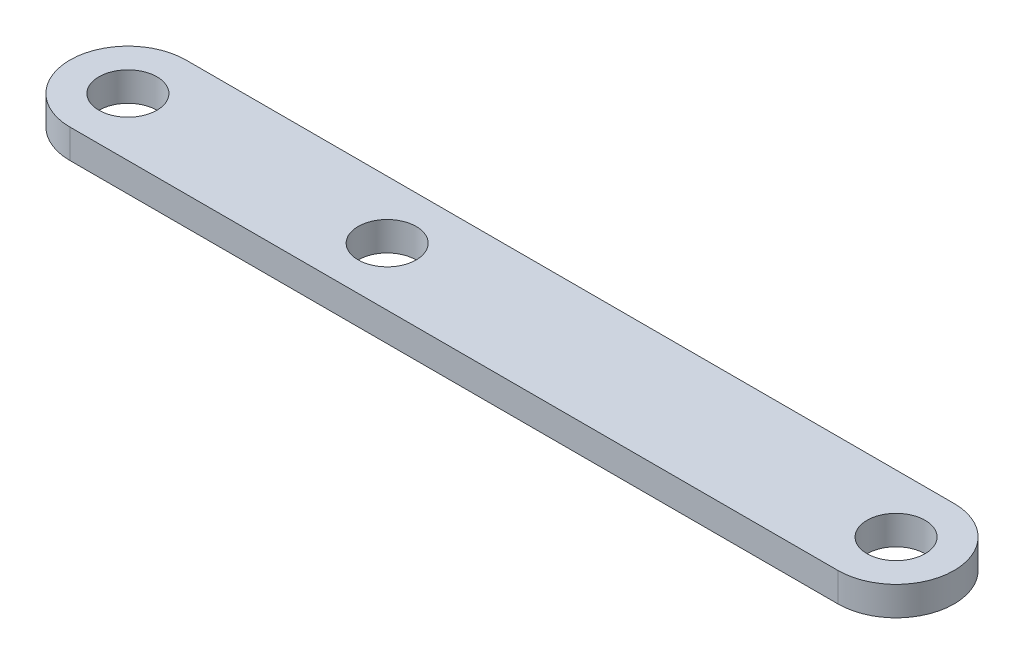
ISO-10303-21;
HEADER;
FILE_DESCRIPTION(('STEP AP214'),'2;1');
FILE_NAME('part.step','',(''),(''),'','','');
FILE_SCHEMA(('AUTOMOTIVE_DESIGN { 1 0 10303 214 1 1 1 1 }'));
ENDSEC;
DATA;
#1=APPLICATION_CONTEXT('core data for automotive mechanical design processes');
#2=APPLICATION_PROTOCOL_DEFINITION('international standard','automotive_design',2000,#1);
#3=PRODUCT_CONTEXT('',#1,'mechanical');
#4=PRODUCT('Part','Part','',(#3));
#5=PRODUCT_RELATED_PRODUCT_CATEGORY('part','',(#4));
#6=PRODUCT_DEFINITION_FORMATION('','',#4);
#7=PRODUCT_DEFINITION_CONTEXT('part definition',#1,'design');
#8=PRODUCT_DEFINITION('design','',#6,#7);
#9=PRODUCT_DEFINITION_SHAPE('','',#8);
#10=(LENGTH_UNIT() NAMED_UNIT(*) SI_UNIT(.MILLI.,.METRE.));
#11=(NAMED_UNIT(*) PLANE_ANGLE_UNIT() SI_UNIT($,.RADIAN.));
#12=(NAMED_UNIT(*) SI_UNIT($,.STERADIAN.) SOLID_ANGLE_UNIT());
#13=UNCERTAINTY_MEASURE_WITH_UNIT(LENGTH_MEASURE(1.E-05),#10,'distance_accuracy_value','');
#14=(GEOMETRIC_REPRESENTATION_CONTEXT(3) GLOBAL_UNCERTAINTY_ASSIGNED_CONTEXT((#13)) GLOBAL_UNIT_ASSIGNED_CONTEXT((#10,
#11,#12)) REPRESENTATION_CONTEXT('',''));
#15=CARTESIAN_POINT('',(0.,0.,0.));
#16=DIRECTION('',(0.,0.,1.));
#17=DIRECTION('',(1.,0.,0.));
#18=AXIS2_PLACEMENT_3D('',#15,#16,#17);
#19=CARTESIAN_POINT('',(0.,3.,0.));
#20=DIRECTION('',(0.,1.,0.));
#21=DIRECTION('',(0.,0.,1.));
#22=AXIS2_PLACEMENT_3D('',#19,#20,#21);
#23=PLANE('',#22);
#24=CARTESIAN_POINT('',(79.41,3.,0.));
#25=DIRECTION('',(0.,1.,0.));
#26=DIRECTION('',(0.,0.,1.));
#27=AXIS2_PLACEMENT_3D('',#24,#25,#26);
#28=CIRCLE('',#27,3.00000000000001);
#29=CARTESIAN_POINT('',(79.41,3.,3.00000000000001));
#30=VERTEX_POINT('',#29);
#31=EDGE_CURVE('E121',#30,#30,#28,.T.);
#32=ORIENTED_EDGE('',*,*,#31,.F.);
#33=EDGE_LOOP('',(#32));
#34=FACE_BOUND('',#33,.T.);
#35=CARTESIAN_POINT('',(0.,3.,0.));
#36=DIRECTION('',(0.,1.,0.));
#37=DIRECTION('',(0.,0.,1.));
#38=AXIS2_PLACEMENT_3D('',#35,#36,#37);
#39=CIRCLE('',#38,6.);
#40=CARTESIAN_POINT('',(0.,3.,-6.));
#41=VERTEX_POINT('',#40);
#42=CARTESIAN_POINT('',(0.,3.,6.));
#43=VERTEX_POINT('',#42);
#44=EDGE_CURVE('E91',#41,#43,#39,.T.);
#45=ORIENTED_EDGE('',*,*,#44,.T.);
#46=DIRECTION('',(1.,0.,0.));
#47=VECTOR('',#46,1.);
#48=CARTESIAN_POINT('',(0.,3.,6.));
#49=LINE('',#48,#47);
#50=CARTESIAN_POINT('',(79.41,3.,6.));
#51=VERTEX_POINT('',#50);
#52=EDGE_CURVE('E86',#43,#51,#49,.T.);
#53=ORIENTED_EDGE('',*,*,#52,.T.);
#54=CARTESIAN_POINT('',(79.41,3.,0.));
#55=DIRECTION('',(0.,1.,0.));
#56=DIRECTION('',(0.,0.,1.));
#57=AXIS2_PLACEMENT_3D('',#54,#55,#56);
#58=CIRCLE('',#57,6.);
#59=CARTESIAN_POINT('',(79.41,3.,-6.));
#60=VERTEX_POINT('',#59);
#61=EDGE_CURVE('E89',#51,#60,#58,.T.);
#62=ORIENTED_EDGE('',*,*,#61,.T.);
#63=DIRECTION('',(-1.,0.,0.));
#64=VECTOR('',#63,1.);
#65=CARTESIAN_POINT('',(0.,3.,-6.));
#66=LINE('',#65,#64);
#67=EDGE_CURVE('E56',#60,#41,#66,.T.);
#68=ORIENTED_EDGE('',*,*,#67,.T.);
#69=EDGE_LOOP('',(#45,#53,#62,#68));
#70=FACE_BOUND('',#69,.T.);
#71=CARTESIAN_POINT('',(0.,3.,0.));
#72=DIRECTION('',(0.,1.,0.));
#73=DIRECTION('',(0.,0.,1.));
#74=AXIS2_PLACEMENT_3D('',#71,#72,#73);
#75=CIRCLE('',#74,3.);
#76=CARTESIAN_POINT('',(0.,3.,3.));
#77=VERTEX_POINT('',#76);
#78=EDGE_CURVE('E106',#77,#77,#75,.T.);
#79=ORIENTED_EDGE('',*,*,#78,.F.);
#80=EDGE_LOOP('',(#79));
#81=FACE_BOUND('',#80,.T.);
#82=CARTESIAN_POINT('',(26.8,3.,0.));
#83=DIRECTION('',(0.,1.,0.));
#84=DIRECTION('',(0.,0.,1.));
#85=AXIS2_PLACEMENT_3D('',#82,#83,#84);
#86=CIRCLE('',#85,3.);
#87=CARTESIAN_POINT('',(26.8,3.,3.));
#88=VERTEX_POINT('',#87);
#89=EDGE_CURVE('E127',#88,#88,#86,.T.);
#90=ORIENTED_EDGE('',*,*,#89,.F.);
#91=EDGE_LOOP('',(#90));
#92=FACE_BOUND('',#91,.T.);
#93=ADVANCED_FACE('F39',(#34,#70,#81,#92),#23,.T.);
#94=CARTESIAN_POINT('',(0.,0.,0.));
#95=DIRECTION('',(0.,1.,0.));
#96=DIRECTION('',(0.,0.,1.));
#97=AXIS2_PLACEMENT_3D('',#94,#95,#96);
#98=PLANE('',#97);
#99=CARTESIAN_POINT('',(0.,0.,0.));
#100=DIRECTION('',(0.,1.,0.));
#101=DIRECTION('',(0.,0.,1.));
#102=AXIS2_PLACEMENT_3D('',#99,#100,#101);
#103=CIRCLE('',#102,6.);
#104=CARTESIAN_POINT('',(0.,0.,-6.));
#105=VERTEX_POINT('',#104);
#106=CARTESIAN_POINT('',(0.,0.,6.));
#107=VERTEX_POINT('',#106);
#108=EDGE_CURVE('E103',#105,#107,#103,.T.);
#109=ORIENTED_EDGE('',*,*,#108,.F.);
#110=DIRECTION('',(-1.,0.,0.));
#111=VECTOR('',#110,1.);
#112=CARTESIAN_POINT('',(0.,0.,-6.));
#113=LINE('',#112,#111);
#114=CARTESIAN_POINT('',(79.41,0.,-6.));
#115=VERTEX_POINT('',#114);
#116=EDGE_CURVE('E79',#115,#105,#113,.T.);
#117=ORIENTED_EDGE('',*,*,#116,.F.);
#118=CARTESIAN_POINT('',(79.41,0.,0.));
#119=DIRECTION('',(0.,1.,0.));
#120=DIRECTION('',(0.,0.,1.));
#121=AXIS2_PLACEMENT_3D('',#118,#119,#120);
#122=CIRCLE('',#121,6.);
#123=CARTESIAN_POINT('',(79.41,0.,6.));
#124=VERTEX_POINT('',#123);
#125=EDGE_CURVE('E73',#124,#115,#122,.T.);
#126=ORIENTED_EDGE('',*,*,#125,.F.);
#127=DIRECTION('',(1.,0.,0.));
#128=VECTOR('',#127,1.);
#129=CARTESIAN_POINT('',(0.,0.,6.));
#130=LINE('',#129,#128);
#131=EDGE_CURVE('E95',#107,#124,#130,.T.);
#132=ORIENTED_EDGE('',*,*,#131,.F.);
#133=EDGE_LOOP('',(#109,#117,#126,#132));
#134=FACE_BOUND('',#133,.T.);
#135=CARTESIAN_POINT('',(0.,0.,0.));
#136=DIRECTION('',(0.,1.,0.));
#137=DIRECTION('',(0.,0.,1.));
#138=AXIS2_PLACEMENT_3D('',#135,#136,#137);
#139=CIRCLE('',#138,3.);
#140=CARTESIAN_POINT('',(0.,0.,3.));
#141=VERTEX_POINT('',#140);
#142=EDGE_CURVE('E118',#141,#141,#139,.T.);
#143=ORIENTED_EDGE('',*,*,#142,.T.);
#144=EDGE_LOOP('',(#143));
#145=FACE_BOUND('',#144,.T.);
#146=CARTESIAN_POINT('',(79.41,0.,0.));
#147=DIRECTION('',(0.,1.,0.));
#148=DIRECTION('',(0.,0.,1.));
#149=AXIS2_PLACEMENT_3D('',#146,#147,#148);
#150=CIRCLE('',#149,3.00000000000001);
#151=CARTESIAN_POINT('',(79.41,0.,3.00000000000001));
#152=VERTEX_POINT('',#151);
#153=EDGE_CURVE('E124',#152,#152,#150,.T.);
#154=ORIENTED_EDGE('',*,*,#153,.T.);
#155=EDGE_LOOP('',(#154));
#156=FACE_BOUND('',#155,.T.);
#157=CARTESIAN_POINT('',(26.8,0.,0.));
#158=DIRECTION('',(0.,1.,0.));
#159=DIRECTION('',(0.,0.,1.));
#160=AXIS2_PLACEMENT_3D('',#157,#158,#159);
#161=CIRCLE('',#160,3.);
#162=CARTESIAN_POINT('',(26.8,0.,3.));
#163=VERTEX_POINT('',#162);
#164=EDGE_CURVE('E130',#163,#163,#161,.T.);
#165=ORIENTED_EDGE('',*,*,#164,.T.);
#166=EDGE_LOOP('',(#165));
#167=FACE_BOUND('',#166,.T.);
#168=ADVANCED_FACE('F114',(#134,#145,#156,#167),#98,.F.);
#169=CARTESIAN_POINT('',(0.,3.,0.));
#170=DIRECTION('',(0.,-1.,0.));
#171=DIRECTION('',(0.,0.,-1.));
#172=AXIS2_PLACEMENT_3D('',#169,#170,#171);
#173=CYLINDRICAL_SURFACE('',#172,6.);
#174=ORIENTED_EDGE('',*,*,#108,.T.);
#175=DIRECTION('',(0.,-1.,0.));
#176=VECTOR('',#175,1.);
#177=CARTESIAN_POINT('',(0.,3.,6.));
#178=LINE('',#177,#176);
#179=EDGE_CURVE('E11',#43,#107,#178,.T.);
#180=ORIENTED_EDGE('',*,*,#179,.F.);
#181=ORIENTED_EDGE('',*,*,#44,.F.);
#182=DIRECTION('',(0.,-1.,0.));
#183=VECTOR('',#182,1.);
#184=CARTESIAN_POINT('',(0.,3.,-6.));
#185=LINE('',#184,#183);
#186=EDGE_CURVE('E99',#41,#105,#185,.T.);
#187=ORIENTED_EDGE('',*,*,#186,.T.);
#188=EDGE_LOOP('',(#174,#180,#181,#187));
#189=FACE_BOUND('',#188,.T.);
#190=ADVANCED_FACE('F41',(#189),#173,.T.);
#191=CARTESIAN_POINT('',(0.,3.,6.));
#192=DIRECTION('',(0.,0.,-1.));
#193=DIRECTION('',(-1.,0.,0.));
#194=AXIS2_PLACEMENT_3D('',#191,#192,#193);
#195=PLANE('',#194);
#196=ORIENTED_EDGE('',*,*,#131,.T.);
#197=DIRECTION('',(0.,-1.,0.));
#198=VECTOR('',#197,1.);
#199=CARTESIAN_POINT('',(79.41,3.,6.));
#200=LINE('',#199,#198);
#201=EDGE_CURVE('E48',#51,#124,#200,.T.);
#202=ORIENTED_EDGE('',*,*,#201,.F.);
#203=ORIENTED_EDGE('',*,*,#52,.F.);
#204=ORIENTED_EDGE('',*,*,#179,.T.);
#205=EDGE_LOOP('',(#196,#202,#203,#204));
#206=FACE_BOUND('',#205,.T.);
#207=ADVANCED_FACE('F94',(#206),#195,.F.);
#208=CARTESIAN_POINT('',(79.41,3.,0.));
#209=DIRECTION('',(0.,-1.,0.));
#210=DIRECTION('',(0.,0.,-1.));
#211=AXIS2_PLACEMENT_3D('',#208,#209,#210);
#212=CYLINDRICAL_SURFACE('',#211,6.);
#213=ORIENTED_EDGE('',*,*,#125,.T.);
#214=DIRECTION('',(0.,-1.,0.));
#215=VECTOR('',#214,1.);
#216=CARTESIAN_POINT('',(79.41,3.,-6.));
#217=LINE('',#216,#215);
#218=EDGE_CURVE('E96',#60,#115,#217,.T.);
#219=ORIENTED_EDGE('',*,*,#218,.F.);
#220=ORIENTED_EDGE('',*,*,#61,.F.);
#221=ORIENTED_EDGE('',*,*,#201,.T.);
#222=EDGE_LOOP('',(#213,#219,#220,#221));
#223=FACE_BOUND('',#222,.T.);
#224=ADVANCED_FACE('F97',(#223),#212,.T.);
#225=CARTESIAN_POINT('',(0.,3.,-6.));
#226=DIRECTION('',(0.,0.,1.));
#227=DIRECTION('',(1.,0.,0.));
#228=AXIS2_PLACEMENT_3D('',#225,#226,#227);
#229=PLANE('',#228);
#230=ORIENTED_EDGE('',*,*,#116,.T.);
#231=ORIENTED_EDGE('',*,*,#186,.F.);
#232=ORIENTED_EDGE('',*,*,#67,.F.);
#233=ORIENTED_EDGE('',*,*,#218,.T.);
#234=EDGE_LOOP('',(#230,#231,#232,#233));
#235=FACE_BOUND('',#234,.T.);
#236=ADVANCED_FACE('F111',(#235),#229,.F.);
#237=CARTESIAN_POINT('',(0.,3.,0.));
#238=DIRECTION('',(0.,-1.,0.));
#239=DIRECTION('',(0.,0.,-1.));
#240=AXIS2_PLACEMENT_3D('',#237,#238,#239);
#241=CYLINDRICAL_SURFACE('',#240,3.);
#242=ORIENTED_EDGE('',*,*,#78,.T.);
#243=EDGE_LOOP('',(#242));
#244=FACE_BOUND('',#243,.T.);
#245=ORIENTED_EDGE('',*,*,#142,.F.);
#246=EDGE_LOOP('',(#245));
#247=FACE_BOUND('',#246,.T.);
#248=ADVANCED_FACE('F148',(#244,#247),#241,.F.);
#249=CARTESIAN_POINT('',(79.41,3.,0.));
#250=DIRECTION('',(0.,-1.,0.));
#251=DIRECTION('',(0.,0.,-1.));
#252=AXIS2_PLACEMENT_3D('',#249,#250,#251);
#253=CYLINDRICAL_SURFACE('',#252,3.00000000000001);
#254=ORIENTED_EDGE('',*,*,#31,.T.);
#255=EDGE_LOOP('',(#254));
#256=FACE_BOUND('',#255,.T.);
#257=ORIENTED_EDGE('',*,*,#153,.F.);
#258=EDGE_LOOP('',(#257));
#259=FACE_BOUND('',#258,.T.);
#260=ADVANCED_FACE('F193',(#256,#259),#253,.F.);
#261=CARTESIAN_POINT('',(26.8,3.,0.));
#262=DIRECTION('',(0.,-1.,0.));
#263=DIRECTION('',(0.,0.,-1.));
#264=AXIS2_PLACEMENT_3D('',#261,#262,#263);
#265=CYLINDRICAL_SURFACE('',#264,3.);
#266=ORIENTED_EDGE('',*,*,#89,.T.);
#267=EDGE_LOOP('',(#266));
#268=FACE_BOUND('',#267,.T.);
#269=ORIENTED_EDGE('',*,*,#164,.F.);
#270=EDGE_LOOP('',(#269));
#271=FACE_BOUND('',#270,.T.);
#272=ADVANCED_FACE('F136',(#268,#271),#265,.F.);
#273=CLOSED_SHELL('',(#93,#168,#190,#207,#224,#236,#248,#260,#272));
#274=MANIFOLD_SOLID_BREP('B2',#273);
#275=ADVANCED_BREP_SHAPE_REPRESENTATION('',(#18,#274),#14);
#276=SHAPE_DEFINITION_REPRESENTATION(#9,#275);
ENDSEC;
END-ISO-10303-21;
